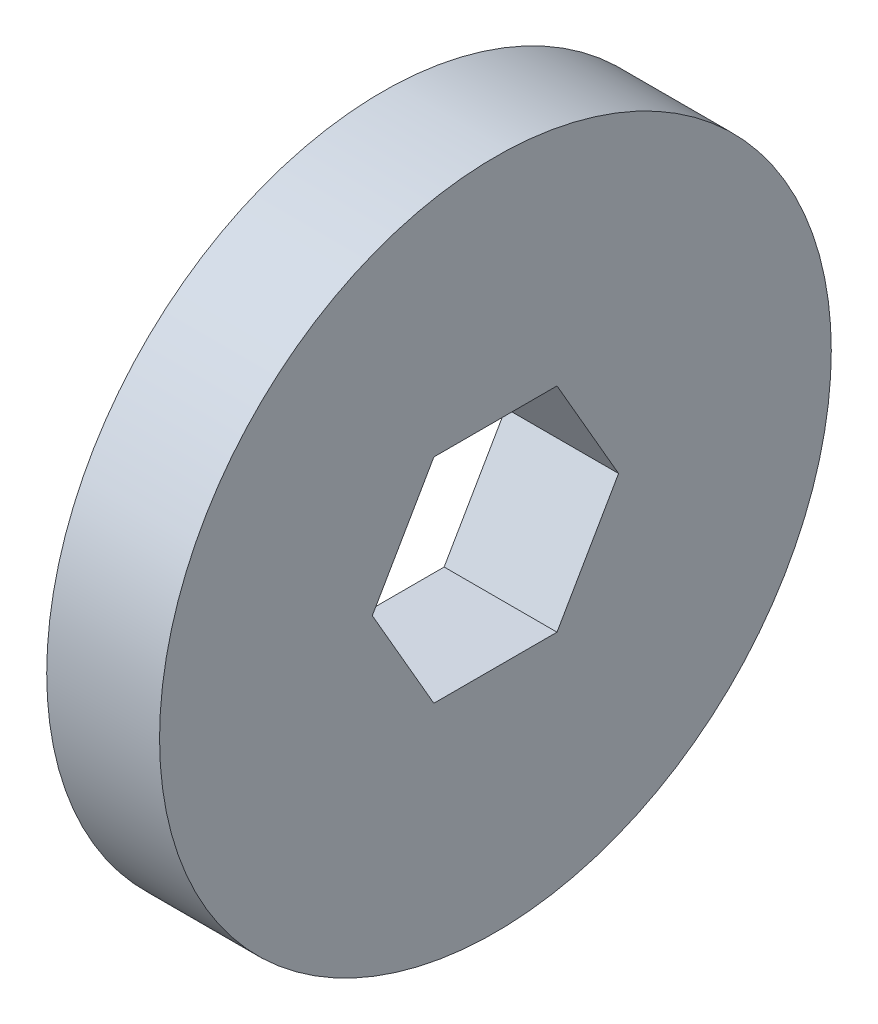
ISO-10303-21;
HEADER;
FILE_DESCRIPTION(('STEP AP214'),'2;1');
FILE_NAME('part.step','',(''),(''),'','','');
FILE_SCHEMA(('AUTOMOTIVE_DESIGN { 1 0 10303 214 1 1 1 1 }'));
ENDSEC;
DATA;
#1=APPLICATION_CONTEXT('core data for automotive mechanical design processes');
#2=APPLICATION_PROTOCOL_DEFINITION('international standard','automotive_design',2000,#1);
#3=PRODUCT_CONTEXT('',#1,'mechanical');
#4=PRODUCT('Part','Part','',(#3));
#5=PRODUCT_RELATED_PRODUCT_CATEGORY('part','',(#4));
#6=PRODUCT_DEFINITION_FORMATION('','',#4);
#7=PRODUCT_DEFINITION_CONTEXT('part definition',#1,'design');
#8=PRODUCT_DEFINITION('design','',#6,#7);
#9=PRODUCT_DEFINITION_SHAPE('','',#8);
#10=(LENGTH_UNIT() NAMED_UNIT(*) SI_UNIT(.MILLI.,.METRE.));
#11=(NAMED_UNIT(*) PLANE_ANGLE_UNIT() SI_UNIT($,.RADIAN.));
#12=(NAMED_UNIT(*) SI_UNIT($,.STERADIAN.) SOLID_ANGLE_UNIT());
#13=UNCERTAINTY_MEASURE_WITH_UNIT(LENGTH_MEASURE(1.E-05),#10,'distance_accuracy_value','');
#14=(GEOMETRIC_REPRESENTATION_CONTEXT(3) GLOBAL_UNCERTAINTY_ASSIGNED_CONTEXT((#13)) GLOBAL_UNIT_ASSIGNED_CONTEXT((#10,
#11,#12)) REPRESENTATION_CONTEXT('',''));
#15=CARTESIAN_POINT('',(0.,0.,0.));
#16=DIRECTION('',(0.,0.,1.));
#17=DIRECTION('',(1.,0.,0.));
#18=AXIS2_PLACEMENT_3D('',#15,#16,#17);
#19=CARTESIAN_POINT('',(6.72,0.,0.));
#20=DIRECTION('',(1.,0.,0.));
#21=DIRECTION('',(0.,0.,-1.));
#22=AXIS2_PLACEMENT_3D('',#19,#20,#21);
#23=PLANE('',#22);
#24=CARTESIAN_POINT('',(6.72,0.,0.));
#25=DIRECTION('',(1.,0.,0.));
#26=DIRECTION('',(0.,0.,-1.));
#27=AXIS2_PLACEMENT_3D('',#24,#25,#26);
#28=CIRCLE('',#27,20.);
#29=CARTESIAN_POINT('',(6.72,0.,-20.));
#30=VERTEX_POINT('',#29);
#31=EDGE_CURVE('E11',#30,#30,#28,.T.);
#32=ORIENTED_EDGE('',*,*,#31,.T.);
#33=EDGE_LOOP('',(#32));
#34=FACE_BOUND('',#33,.T.);
#35=DIRECTION('',(0.,0.866025403784438,0.5));
#36=VECTOR('',#35,1.);
#37=CARTESIAN_POINT('',(6.72,0.,-7.33234841870825));
#38=LINE('',#37,#36);
#39=CARTESIAN_POINT('',(6.72,0.,-7.33234841870825));
#40=VERTEX_POINT('',#39);
#41=CARTESIAN_POINT('',(6.72,6.35,-3.66617420935412));
#42=VERTEX_POINT('',#41);
#43=EDGE_CURVE('E112',#40,#42,#38,.T.);
#44=ORIENTED_EDGE('',*,*,#43,.F.);
#45=DIRECTION('',(0.,0.866025403784439,-0.5));
#46=VECTOR('',#45,1.);
#47=CARTESIAN_POINT('',(6.72,-6.35,-3.66617420935413));
#48=LINE('',#47,#46);
#49=CARTESIAN_POINT('',(6.72,-6.35,-3.66617420935413));
#50=VERTEX_POINT('',#49);
#51=EDGE_CURVE('E103',#50,#40,#48,.T.);
#52=ORIENTED_EDGE('',*,*,#51,.F.);
#53=DIRECTION('',(0.,0.,-1.));
#54=VECTOR('',#53,1.);
#55=CARTESIAN_POINT('',(6.72,-6.35,3.66617420935412));
#56=LINE('',#55,#54);
#57=CARTESIAN_POINT('',(6.72,-6.35,3.66617420935412));
#58=VERTEX_POINT('',#57);
#59=EDGE_CURVE('E137',#58,#50,#56,.T.);
#60=ORIENTED_EDGE('',*,*,#59,.F.);
#61=DIRECTION('',(0.,-0.866025403784439,-0.5));
#62=VECTOR('',#61,1.);
#63=CARTESIAN_POINT('',(6.72,0.,7.33234841870825));
#64=LINE('',#63,#62);
#65=CARTESIAN_POINT('',(6.72,0.,7.33234841870825));
#66=VERTEX_POINT('',#65);
#67=EDGE_CURVE('E134',#66,#58,#64,.T.);
#68=ORIENTED_EDGE('',*,*,#67,.F.);
#69=DIRECTION('',(0.,-0.866025403784438,0.5));
#70=VECTOR('',#69,1.);
#71=CARTESIAN_POINT('',(6.72,6.35,3.66617420935412));
#72=LINE('',#71,#70);
#73=CARTESIAN_POINT('',(6.72,6.35,3.66617420935412));
#74=VERTEX_POINT('',#73);
#75=EDGE_CURVE('E129',#74,#66,#72,.T.);
#76=ORIENTED_EDGE('',*,*,#75,.F.);
#77=DIRECTION('',(0.,0.,1.));
#78=VECTOR('',#77,1.);
#79=CARTESIAN_POINT('',(6.72,6.35,-3.66617420935412));
#80=LINE('',#79,#78);
#81=EDGE_CURVE('E125',#42,#74,#80,.T.);
#82=ORIENTED_EDGE('',*,*,#81,.F.);
#83=EDGE_LOOP('',(#44,#52,#60,#68,#76,#82));
#84=FACE_BOUND('',#83,.T.);
#85=ADVANCED_FACE('F49',(#34,#84),#23,.T.);
#86=CARTESIAN_POINT('',(0.,0.,0.));
#87=DIRECTION('',(1.,0.,0.));
#88=DIRECTION('',(0.,0.,-1.));
#89=AXIS2_PLACEMENT_3D('',#86,#87,#88);
#90=PLANE('',#89);
#91=CARTESIAN_POINT('',(0.,0.,0.));
#92=DIRECTION('',(1.,0.,0.));
#93=DIRECTION('',(0.,0.,-1.));
#94=AXIS2_PLACEMENT_3D('',#91,#92,#93);
#95=CIRCLE('',#94,20.);
#96=CARTESIAN_POINT('',(0.,0.,-20.));
#97=VERTEX_POINT('',#96);
#98=EDGE_CURVE('E53',#97,#97,#95,.T.);
#99=ORIENTED_EDGE('',*,*,#98,.F.);
#100=EDGE_LOOP('',(#99));
#101=FACE_BOUND('',#100,.T.);
#102=DIRECTION('',(0.,0.866025403784439,-0.5));
#103=VECTOR('',#102,1.);
#104=CARTESIAN_POINT('',(0.,-6.35,-3.66617420935413));
#105=LINE('',#104,#103);
#106=CARTESIAN_POINT('',(0.,-6.35,-3.66617420935413));
#107=VERTEX_POINT('',#106);
#108=CARTESIAN_POINT('',(0.,0.,-7.33234841870825));
#109=VERTEX_POINT('',#108);
#110=EDGE_CURVE('E73',#107,#109,#105,.T.);
#111=ORIENTED_EDGE('',*,*,#110,.T.);
#112=DIRECTION('',(0.,0.866025403784438,0.5));
#113=VECTOR('',#112,1.);
#114=CARTESIAN_POINT('',(0.,0.,-7.33234841870825));
#115=LINE('',#114,#113);
#116=CARTESIAN_POINT('',(0.,6.35,-3.66617420935412));
#117=VERTEX_POINT('',#116);
#118=EDGE_CURVE('E119',#109,#117,#115,.T.);
#119=ORIENTED_EDGE('',*,*,#118,.T.);
#120=DIRECTION('',(0.,0.,1.));
#121=VECTOR('',#120,1.);
#122=CARTESIAN_POINT('',(0.,6.35,-3.66617420935412));
#123=LINE('',#122,#121);
#124=CARTESIAN_POINT('',(0.,6.35,3.66617420935412));
#125=VERTEX_POINT('',#124);
#126=EDGE_CURVE('E144',#117,#125,#123,.T.);
#127=ORIENTED_EDGE('',*,*,#126,.T.);
#128=DIRECTION('',(0.,-0.866025403784438,0.5));
#129=VECTOR('',#128,1.);
#130=CARTESIAN_POINT('',(0.,6.35,3.66617420935412));
#131=LINE('',#130,#129);
#132=CARTESIAN_POINT('',(0.,0.,7.33234841870825));
#133=VERTEX_POINT('',#132);
#134=EDGE_CURVE('E148',#125,#133,#131,.T.);
#135=ORIENTED_EDGE('',*,*,#134,.T.);
#136=DIRECTION('',(0.,-0.866025403784439,-0.5));
#137=VECTOR('',#136,1.);
#138=CARTESIAN_POINT('',(0.,0.,7.33234841870825));
#139=LINE('',#138,#137);
#140=CARTESIAN_POINT('',(0.,-6.35,3.66617420935412));
#141=VERTEX_POINT('',#140);
#142=EDGE_CURVE('E152',#133,#141,#139,.T.);
#143=ORIENTED_EDGE('',*,*,#142,.T.);
#144=DIRECTION('',(0.,0.,-1.));
#145=VECTOR('',#144,1.);
#146=CARTESIAN_POINT('',(0.,-6.35,3.66617420935412));
#147=LINE('',#146,#145);
#148=EDGE_CURVE('E113',#141,#107,#147,.T.);
#149=ORIENTED_EDGE('',*,*,#148,.T.);
#150=EDGE_LOOP('',(#111,#119,#127,#135,#143,#149));
#151=FACE_BOUND('',#150,.T.);
#152=ADVANCED_FACE('F176',(#101,#151),#90,.F.);
#153=CARTESIAN_POINT('',(6.72,0.,0.));
#154=DIRECTION('',(-1.,0.,0.));
#155=DIRECTION('',(0.,0.,1.));
#156=AXIS2_PLACEMENT_3D('',#153,#154,#155);
#157=CYLINDRICAL_SURFACE('',#156,20.);
#158=ORIENTED_EDGE('',*,*,#31,.F.);
#159=EDGE_LOOP('',(#158));
#160=FACE_BOUND('',#159,.T.);
#161=ORIENTED_EDGE('',*,*,#98,.T.);
#162=EDGE_LOOP('',(#161));
#163=FACE_BOUND('',#162,.T.);
#164=ADVANCED_FACE('F51',(#160,#163),#157,.T.);
#165=CARTESIAN_POINT('',(6.72,-6.35,-3.66617420935413));
#166=DIRECTION('',(0.,0.5,0.866025403784439));
#167=DIRECTION('',(0.,-0.866025403784439,0.5));
#168=AXIS2_PLACEMENT_3D('',#165,#166,#167);
#169=PLANE('',#168);
#170=ORIENTED_EDGE('',*,*,#110,.F.);
#171=DIRECTION('',(-1.,0.,0.));
#172=VECTOR('',#171,1.);
#173=CARTESIAN_POINT('',(6.72,-6.35,-3.66617420935413));
#174=LINE('',#173,#172);
#175=EDGE_CURVE('E107',#50,#107,#174,.T.);
#176=ORIENTED_EDGE('',*,*,#175,.F.);
#177=ORIENTED_EDGE('',*,*,#51,.T.);
#178=DIRECTION('',(-1.,0.,0.));
#179=VECTOR('',#178,1.);
#180=CARTESIAN_POINT('',(6.72,0.,-7.33234841870825));
#181=LINE('',#180,#179);
#182=EDGE_CURVE('E106',#40,#109,#181,.T.);
#183=ORIENTED_EDGE('',*,*,#182,.T.);
#184=EDGE_LOOP('',(#170,#176,#177,#183));
#185=FACE_BOUND('',#184,.T.);
#186=ADVANCED_FACE('F105',(#185),#169,.T.);
#187=CARTESIAN_POINT('',(6.72,0.,-7.33234841870825));
#188=DIRECTION('',(0.,-0.5,0.866025403784439));
#189=DIRECTION('',(0.,-0.866025403784438,-0.5));
#190=AXIS2_PLACEMENT_3D('',#187,#188,#189);
#191=PLANE('',#190);
#192=ORIENTED_EDGE('',*,*,#118,.F.);
#193=ORIENTED_EDGE('',*,*,#182,.F.);
#194=ORIENTED_EDGE('',*,*,#43,.T.);
#195=DIRECTION('',(-1.,0.,0.));
#196=VECTOR('',#195,1.);
#197=CARTESIAN_POINT('',(6.72,6.35,-3.66617420935412));
#198=LINE('',#197,#196);
#199=EDGE_CURVE('E121',#42,#117,#198,.T.);
#200=ORIENTED_EDGE('',*,*,#199,.T.);
#201=EDGE_LOOP('',(#192,#193,#194,#200));
#202=FACE_BOUND('',#201,.T.);
#203=ADVANCED_FACE('F116',(#202),#191,.T.);
#204=CARTESIAN_POINT('',(6.72,6.35,-3.66617420935412));
#205=DIRECTION('',(0.,-1.,0.));
#206=DIRECTION('',(0.,0.,-1.));
#207=AXIS2_PLACEMENT_3D('',#204,#205,#206);
#208=PLANE('',#207);
#209=ORIENTED_EDGE('',*,*,#126,.F.);
#210=ORIENTED_EDGE('',*,*,#199,.F.);
#211=ORIENTED_EDGE('',*,*,#81,.T.);
#212=DIRECTION('',(-1.,0.,0.));
#213=VECTOR('',#212,1.);
#214=CARTESIAN_POINT('',(6.72,6.35,3.66617420935412));
#215=LINE('',#214,#213);
#216=EDGE_CURVE('E166',#74,#125,#215,.T.);
#217=ORIENTED_EDGE('',*,*,#216,.T.);
#218=EDGE_LOOP('',(#209,#210,#211,#217));
#219=FACE_BOUND('',#218,.T.);
#220=ADVANCED_FACE('F172',(#219),#208,.T.);
#221=CARTESIAN_POINT('',(6.72,6.35,3.66617420935412));
#222=DIRECTION('',(0.,-0.5,-0.866025403784439));
#223=DIRECTION('',(0.,0.866025403784439,-0.5));
#224=AXIS2_PLACEMENT_3D('',#221,#222,#223);
#225=PLANE('',#224);
#226=ORIENTED_EDGE('',*,*,#134,.F.);
#227=ORIENTED_EDGE('',*,*,#216,.F.);
#228=ORIENTED_EDGE('',*,*,#75,.T.);
#229=DIRECTION('',(-1.,0.,0.));
#230=VECTOR('',#229,1.);
#231=CARTESIAN_POINT('',(6.72,0.,7.33234841870825));
#232=LINE('',#231,#230);
#233=EDGE_CURVE('E163',#66,#133,#232,.T.);
#234=ORIENTED_EDGE('',*,*,#233,.T.);
#235=EDGE_LOOP('',(#226,#227,#228,#234));
#236=FACE_BOUND('',#235,.T.);
#237=ADVANCED_FACE('F184',(#236),#225,.T.);
#238=CARTESIAN_POINT('',(6.72,0.,7.33234841870825));
#239=DIRECTION('',(0.,0.5,-0.866025403784438));
#240=DIRECTION('',(0.,0.866025403784439,0.5));
#241=AXIS2_PLACEMENT_3D('',#238,#239,#240);
#242=PLANE('',#241);
#243=ORIENTED_EDGE('',*,*,#142,.F.);
#244=ORIENTED_EDGE('',*,*,#233,.F.);
#245=ORIENTED_EDGE('',*,*,#67,.T.);
#246=DIRECTION('',(-1.,0.,0.));
#247=VECTOR('',#246,1.);
#248=CARTESIAN_POINT('',(6.72,-6.35,3.66617420935412));
#249=LINE('',#248,#247);
#250=EDGE_CURVE('E65',#58,#141,#249,.T.);
#251=ORIENTED_EDGE('',*,*,#250,.T.);
#252=EDGE_LOOP('',(#243,#244,#245,#251));
#253=FACE_BOUND('',#252,.T.);
#254=ADVANCED_FACE('F182',(#253),#242,.T.);
#255=CARTESIAN_POINT('',(6.72,-6.35,3.66617420935412));
#256=DIRECTION('',(0.,1.,0.));
#257=DIRECTION('',(0.,0.,1.));
#258=AXIS2_PLACEMENT_3D('',#255,#256,#257);
#259=PLANE('',#258);
#260=ORIENTED_EDGE('',*,*,#148,.F.);
#261=ORIENTED_EDGE('',*,*,#250,.F.);
#262=ORIENTED_EDGE('',*,*,#59,.T.);
#263=ORIENTED_EDGE('',*,*,#175,.T.);
#264=EDGE_LOOP('',(#260,#261,#262,#263));
#265=FACE_BOUND('',#264,.T.);
#266=ADVANCED_FACE('F178',(#265),#259,.T.);
#267=CLOSED_SHELL('',(#85,#152,#164,#186,#203,#220,#237,#254,#266));
#268=MANIFOLD_SOLID_BREP('B2',#267);
#269=ADVANCED_BREP_SHAPE_REPRESENTATION('',(#18,#268),#14);
#270=SHAPE_DEFINITION_REPRESENTATION(#9,#269);
ENDSEC;
END-ISO-10303-21;
